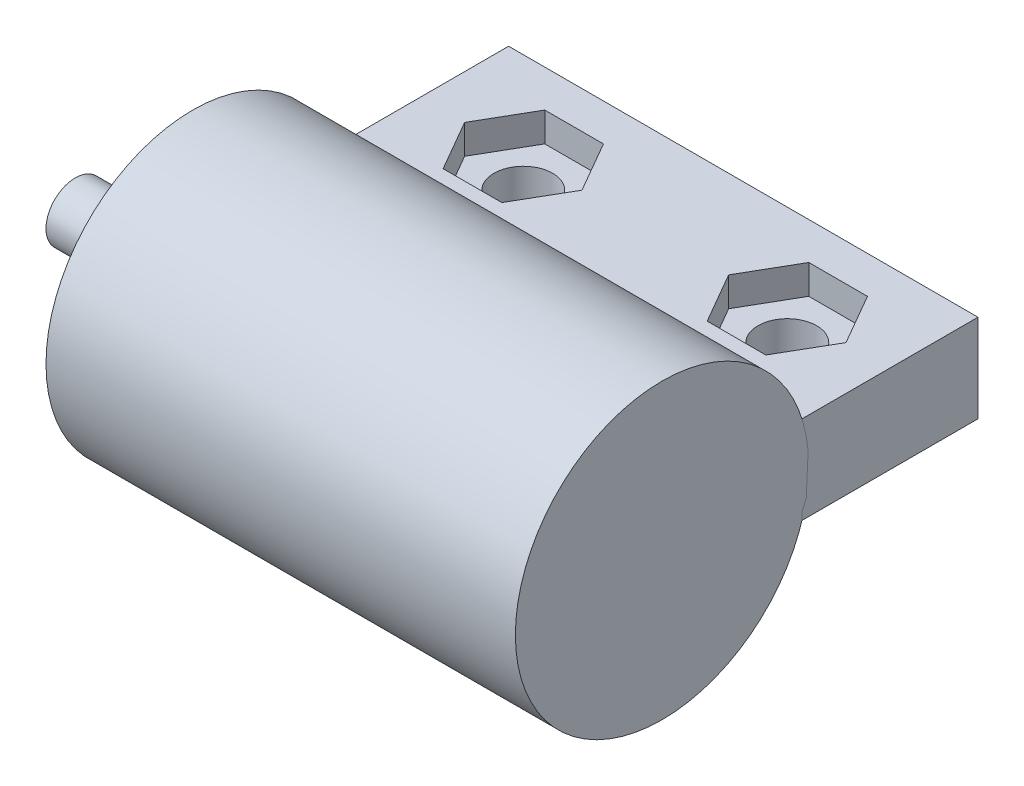
ISO-10303-21;
HEADER;
FILE_DESCRIPTION(('STEP AP214'),'2;1');
FILE_NAME('part.step','',(''),(''),'','','');
FILE_SCHEMA(('AUTOMOTIVE_DESIGN { 1 0 10303 214 1 1 1 1 }'));
ENDSEC;
DATA;
#1=APPLICATION_CONTEXT('core data for automotive mechanical design processes');
#2=APPLICATION_PROTOCOL_DEFINITION('international standard','automotive_design',2000,#1);
#3=PRODUCT_CONTEXT('',#1,'mechanical');
#4=PRODUCT('Part','Part','',(#3));
#5=PRODUCT_RELATED_PRODUCT_CATEGORY('part','',(#4));
#6=PRODUCT_DEFINITION_FORMATION('','',#4);
#7=PRODUCT_DEFINITION_CONTEXT('part definition',#1,'design');
#8=PRODUCT_DEFINITION('design','',#6,#7);
#9=PRODUCT_DEFINITION_SHAPE('','',#8);
#10=(LENGTH_UNIT() NAMED_UNIT(*) SI_UNIT(.MILLI.,.METRE.));
#11=(NAMED_UNIT(*) PLANE_ANGLE_UNIT() SI_UNIT($,.RADIAN.));
#12=(NAMED_UNIT(*) SI_UNIT($,.STERADIAN.) SOLID_ANGLE_UNIT());
#13=UNCERTAINTY_MEASURE_WITH_UNIT(LENGTH_MEASURE(1.E-05),#10,'distance_accuracy_value','');
#14=(GEOMETRIC_REPRESENTATION_CONTEXT(3) GLOBAL_UNCERTAINTY_ASSIGNED_CONTEXT((#13)) GLOBAL_UNIT_ASSIGNED_CONTEXT((#10,
#11,#12)) REPRESENTATION_CONTEXT('',''));
#15=CARTESIAN_POINT('',(0.,0.,0.));
#16=DIRECTION('',(0.,0.,1.));
#17=DIRECTION('',(1.,0.,0.));
#18=AXIS2_PLACEMENT_3D('',#15,#16,#17);
#19=CARTESIAN_POINT('',(-7.07106781186547,0.749999999999999,2.38484800354237));
#20=DIRECTION('',(1.,0.,0.));
#21=DIRECTION('',(0.,0.,-1.));
#22=AXIS2_PLACEMENT_3D('',#19,#20,#21);
#23=CYLINDRICAL_SURFACE('',#22,2.5);
#24=CARTESIAN_POINT('',(0.,0.749999999999999,2.38484800354237));
#25=DIRECTION('',(1.,0.,0.));
#26=DIRECTION('',(0.,0.,-1.));
#27=AXIS2_PLACEMENT_3D('',#24,#25,#26);
#28=CIRCLE('',#27,2.5);
#29=CARTESIAN_POINT('',(0.,0.749999999999999,-0.115151996457631));
#30=VERTEX_POINT('',#29);
#31=EDGE_CURVE('E58',#30,#30,#28,.F.);
#32=ORIENTED_EDGE('',*,*,#31,.F.);
#33=EDGE_LOOP('',(#32));
#34=FACE_BOUND('',#33,.T.);
#35=CARTESIAN_POINT('',(8.,0.749999999999999,2.38484800354237));
#36=DIRECTION('',(1.,0.,0.));
#37=DIRECTION('',(0.,0.,-1.));
#38=AXIS2_PLACEMENT_3D('',#35,#36,#37);
#39=CIRCLE('',#38,2.5);
#40=CARTESIAN_POINT('',(8.,0.749999999999999,-0.115151996457631));
#41=VERTEX_POINT('',#40);
#42=EDGE_CURVE('E68',#41,#41,#39,.T.);
#43=ORIENTED_EDGE('',*,*,#42,.F.);
#44=EDGE_LOOP('',(#43));
#45=FACE_BOUND('',#44,.T.);
#46=ADVANCED_FACE('F55',(#34,#45),#23,.T.);
#47=CARTESIAN_POINT('',(8.,0.749999999999999,2.38484800354237));
#48=DIRECTION('',(1.,0.,0.));
#49=DIRECTION('',(0.,0.,-1.));
#50=AXIS2_PLACEMENT_3D('',#47,#48,#49);
#51=PLANE('',#50);
#52=ORIENTED_EDGE('',*,*,#42,.T.);
#53=EDGE_LOOP('',(#52));
#54=FACE_BOUND('',#53,.T.);
#55=ADVANCED_FACE('F90',(#54),#51,.T.);
#56=CARTESIAN_POINT('',(0.,1.,0.));
#57=DIRECTION('',(1.,0.,0.));
#58=DIRECTION('',(0.,0.,-1.));
#59=AXIS2_PLACEMENT_3D('',#56,#57,#58);
#60=PLANE('',#59);
#61=CARTESIAN_POINT('',(0.,0.749999999999999,2.38484800354236));
#62=DIRECTION('',(-1.,0.,0.));
#63=DIRECTION('',(0.,0.,1.));
#64=AXIS2_PLACEMENT_3D('',#61,#62,#63);
#65=CIRCLE('',#64,0.5);
#66=CARTESIAN_POINT('',(0.,0.749999999999999,2.88484800354236));
#67=VERTEX_POINT('',#66);
#68=EDGE_CURVE('E11',#67,#67,#65,.T.);
#69=ORIENTED_EDGE('',*,*,#68,.F.);
#70=EDGE_LOOP('',(#69));
#71=FACE_BOUND('',#70,.T.);
#72=ORIENTED_EDGE('',*,*,#31,.T.);
#73=EDGE_LOOP('',(#72));
#74=FACE_BOUND('',#73,.T.);
#75=ADVANCED_FACE('F83',(#71,#74),#60,.F.);
#76=CARTESIAN_POINT('',(-2.,0.749999999999999,2.38484800354236));
#77=DIRECTION('',(1.,0.,0.));
#78=DIRECTION('',(0.,0.,-1.));
#79=AXIS2_PLACEMENT_3D('',#76,#77,#78);
#80=CYLINDRICAL_SURFACE('',#79,0.5);
#81=CARTESIAN_POINT('',(-2.,0.749999999999999,2.38484800354236));
#82=DIRECTION('',(-1.,0.,0.));
#83=DIRECTION('',(0.,0.,1.));
#84=AXIS2_PLACEMENT_3D('',#81,#82,#83);
#85=CIRCLE('',#84,0.5);
#86=CARTESIAN_POINT('',(-2.,0.749999999999999,2.88484800354236));
#87=VERTEX_POINT('',#86);
#88=EDGE_CURVE('E70',#87,#87,#85,.T.);
#89=ORIENTED_EDGE('',*,*,#88,.F.);
#90=EDGE_LOOP('',(#89));
#91=FACE_BOUND('',#90,.T.);
#92=ORIENTED_EDGE('',*,*,#68,.T.);
#93=EDGE_LOOP('',(#92));
#94=FACE_BOUND('',#93,.T.);
#95=ADVANCED_FACE('F81',(#91,#94),#80,.T.);
#96=CARTESIAN_POINT('',(-2.,0.749999999999999,2.38484800354236));
#97=DIRECTION('',(-1.,0.,0.));
#98=DIRECTION('',(0.,0.,1.));
#99=AXIS2_PLACEMENT_3D('',#96,#97,#98);
#100=PLANE('',#99);
#101=ORIENTED_EDGE('',*,*,#88,.T.);
#102=EDGE_LOOP('',(#101));
#103=FACE_BOUND('',#102,.T.);
#104=ADVANCED_FACE('F79',(#103),#100,.T.);
#105=CLOSED_SHELL('',(#46,#55,#75,#95,#104));
#106=MANIFOLD_SOLID_BREP('B2',#105);
#107=CARTESIAN_POINT('',(0.,1.,0.));
#108=DIRECTION('',(0.,-1.,0.));
#109=DIRECTION('',(0.,0.,-1.));
#110=AXIS2_PLACEMENT_3D('',#107,#108,#109);
#111=PLANE('',#110);
#112=CARTESIAN_POINT('',(1.75,1.,-1.5));
#113=DIRECTION('',(0.,1.,0.));
#114=DIRECTION('',(0.,0.,1.));
#115=AXIS2_PLACEMENT_3D('',#112,#113,#114);
#116=CIRCLE('',#115,0.5);
#117=CARTESIAN_POINT('',(1.75,1.,-1.));
#118=VERTEX_POINT('',#117);
#119=EDGE_CURVE('E283',#118,#118,#116,.T.);
#120=ORIENTED_EDGE('',*,*,#119,.F.);
#121=EDGE_LOOP('',(#120));
#122=FACE_BOUND('',#121,.T.);
#123=DIRECTION('',(-1.,0.,0.));
#124=VECTOR('',#123,1.);
#125=CARTESIAN_POINT('',(0.,1.,-0.63397459621556));
#126=LINE('',#125,#124);
#127=CARTESIAN_POINT('',(2.25,1.,-0.63397459621556));
#128=VERTEX_POINT('',#127);
#129=CARTESIAN_POINT('',(1.25,1.,-0.63397459621556));
#130=VERTEX_POINT('',#129);
#131=EDGE_CURVE('E145',#128,#130,#126,.T.);
#132=ORIENTED_EDGE('',*,*,#131,.F.);
#133=DIRECTION('',(0.499999999999998,0.,-0.86602540378444));
#134=VECTOR('',#133,1.);
#135=CARTESIAN_POINT('',(1.41298094716168,1.,0.815784930203602));
#136=LINE('',#135,#134);
#137=CARTESIAN_POINT('',(2.75,1.,-1.5));
#138=VERTEX_POINT('',#137);
#139=EDGE_CURVE('E150',#128,#138,#136,.T.);
#140=ORIENTED_EDGE('',*,*,#139,.T.);
#141=DIRECTION('',(0.499999999999998,0.,0.86602540378444));
#142=VECTOR('',#141,1.);
#143=CARTESIAN_POINT('',(2.71201905283833,1.,-1.5657849302036));
#144=LINE('',#143,#142);
#145=CARTESIAN_POINT('',(2.25,1.,-2.36602540378444));
#146=VERTEX_POINT('',#145);
#147=EDGE_CURVE('E360',#146,#138,#144,.T.);
#148=ORIENTED_EDGE('',*,*,#147,.F.);
#149=DIRECTION('',(-1.,0.,0.));
#150=VECTOR('',#149,1.);
#151=CARTESIAN_POINT('',(0.,1.,-2.36602540378444));
#152=LINE('',#151,#150);
#153=CARTESIAN_POINT('',(1.25,1.,-2.36602540378444));
#154=VERTEX_POINT('',#153);
#155=EDGE_CURVE('E358',#146,#154,#152,.T.);
#156=ORIENTED_EDGE('',*,*,#155,.T.);
#157=DIRECTION('',(-0.499999999999998,0.,0.86602540378444));
#158=VECTOR('',#157,1.);
#159=CARTESIAN_POINT('',(-0.0870190528383232,1.,-0.0502404735808319));
#160=LINE('',#159,#158);
#161=CARTESIAN_POINT('',(0.750000000000002,1.,-1.5));
#162=VERTEX_POINT('',#161);
#163=EDGE_CURVE('E356',#154,#162,#160,.T.);
#164=ORIENTED_EDGE('',*,*,#163,.T.);
#165=DIRECTION('',(-0.499999999999998,0.,-0.86602540378444));
#166=VECTOR('',#165,1.);
#167=CARTESIAN_POINT('',(1.21201905283833,1.,-0.699759526419161));
#168=LINE('',#167,#166);
#169=EDGE_CURVE('E354',#130,#162,#168,.T.);
#170=ORIENTED_EDGE('',*,*,#169,.F.);
#171=EDGE_LOOP('',(#132,#140,#148,#156,#164,#170));
#172=FACE_BOUND('',#171,.T.);
#173=ADVANCED_FACE('F130',(#122,#172),#111,.F.);
#174=DIRECTION('',(1.,0.,0.));
#175=VECTOR('',#174,1.);
#176=CARTESIAN_POINT('',(0.,1.,-2.36602540378444));
#177=LINE('',#176,#175);
#178=CARTESIAN_POINT('',(5.75,1.,-2.36602540378444));
#179=VERTEX_POINT('',#178);
#180=CARTESIAN_POINT('',(6.75,1.,-2.36602540378444));
#181=VERTEX_POINT('',#180);
#182=EDGE_CURVE('E366',#179,#181,#177,.T.);
#183=ORIENTED_EDGE('',*,*,#182,.F.);
#184=DIRECTION('',(-0.499999999999997,0.,0.86602540378444));
#185=VECTOR('',#184,1.);
#186=CARTESIAN_POINT('',(3.28798094716169,1.,1.89831668493415));
#187=LINE('',#186,#185);
#188=CARTESIAN_POINT('',(5.25,1.,-1.5));
#189=VERTEX_POINT('',#188);
#190=EDGE_CURVE('E364',#179,#189,#187,.T.);
#191=ORIENTED_EDGE('',*,*,#190,.T.);
#192=DIRECTION('',(-0.499999999999997,0.,-0.86602540378444));
#193=VECTOR('',#192,1.);
#194=CARTESIAN_POINT('',(4.58701905283834,1.,-2.64831668493414));
#195=LINE('',#194,#193);
#196=CARTESIAN_POINT('',(5.75,1.,-0.633974596215561));
#197=VERTEX_POINT('',#196);
#198=EDGE_CURVE('E263',#197,#189,#195,.T.);
#199=ORIENTED_EDGE('',*,*,#198,.F.);
#200=DIRECTION('',(1.,0.,0.));
#201=VECTOR('',#200,1.);
#202=CARTESIAN_POINT('',(0.,1.,-0.63397459621556));
#203=LINE('',#202,#201);
#204=CARTESIAN_POINT('',(6.75,1.,-0.633974596215561));
#205=VERTEX_POINT('',#204);
#206=EDGE_CURVE('E374',#197,#205,#203,.T.);
#207=ORIENTED_EDGE('',*,*,#206,.T.);
#208=DIRECTION('',(0.499999999999997,0.,-0.86602540378444));
#209=VECTOR('',#208,1.);
#210=CARTESIAN_POINT('',(4.78798094716169,1.,2.76434208871858));
#211=LINE('',#210,#209);
#212=CARTESIAN_POINT('',(7.25,1.,-1.5));
#213=VERTEX_POINT('',#212);
#214=EDGE_CURVE('E372',#205,#213,#211,.T.);
#215=ORIENTED_EDGE('',*,*,#214,.T.);
#216=DIRECTION('',(0.499999999999998,0.,0.86602540378444));
#217=VECTOR('',#216,1.);
#218=CARTESIAN_POINT('',(6.08701905283834,1.,-3.51434208871858));
#219=LINE('',#218,#217);
#220=EDGE_CURVE('E369',#181,#213,#219,.T.);
#221=ORIENTED_EDGE('',*,*,#220,.F.);
#222=EDGE_LOOP('',(#183,#191,#199,#207,#215,#221));
#223=FACE_BOUND('',#222,.T.);
#224=CARTESIAN_POINT('',(6.25,1.,-1.5));
#225=DIRECTION('',(0.,1.,0.));
#226=DIRECTION('',(0.,0.,1.));
#227=AXIS2_PLACEMENT_3D('',#224,#225,#226);
#228=CIRCLE('',#227,0.500000000000001);
#229=CARTESIAN_POINT('',(6.25,1.,-0.999999999999999));
#230=VERTEX_POINT('',#229);
#231=EDGE_CURVE('E275',#230,#230,#228,.T.);
#232=ORIENTED_EDGE('',*,*,#231,.F.);
#233=EDGE_LOOP('',(#232));
#234=FACE_BOUND('',#233,.T.);
#235=ADVANCED_FACE('F426',(#223,#234),#111,.F.);
#236=CARTESIAN_POINT('',(0.,0.,0.));
#237=DIRECTION('',(0.,-1.,0.));
#238=DIRECTION('',(0.,0.,-1.));
#239=AXIS2_PLACEMENT_3D('',#236,#237,#238);
#240=PLANE('',#239);
#241=CARTESIAN_POINT('',(1.75,0.,-1.5));
#242=DIRECTION('',(0.,1.,0.));
#243=DIRECTION('',(0.,0.,1.));
#244=AXIS2_PLACEMENT_3D('',#241,#242,#243);
#245=CIRCLE('',#244,0.5);
#246=CARTESIAN_POINT('',(1.75,0.,-1.));
#247=VERTEX_POINT('',#246);
#248=EDGE_CURVE('E278',#247,#247,#245,.T.);
#249=ORIENTED_EDGE('',*,*,#248,.T.);
#250=EDGE_LOOP('',(#249));
#251=FACE_BOUND('',#250,.T.);
#252=DIRECTION('',(0.,0.,1.));
#253=VECTOR('',#252,1.);
#254=CARTESIAN_POINT('',(0.,0.,0.));
#255=LINE('',#254,#253);
#256=CARTESIAN_POINT('',(0.,0.,-3.));
#257=VERTEX_POINT('',#256);
#258=CARTESIAN_POINT('',(0.,0.,0.));
#259=VERTEX_POINT('',#258);
#260=EDGE_CURVE('E286',#257,#259,#255,.T.);
#261=ORIENTED_EDGE('',*,*,#260,.F.);
#262=DIRECTION('',(-1.,0.,0.));
#263=VECTOR('',#262,1.);
#264=CARTESIAN_POINT('',(0.,0.,-3.));
#265=LINE('',#264,#263);
#266=CARTESIAN_POINT('',(8.,0.,-3.));
#267=VERTEX_POINT('',#266);
#268=EDGE_CURVE('E295',#267,#257,#265,.T.);
#269=ORIENTED_EDGE('',*,*,#268,.F.);
#270=DIRECTION('',(0.,0.,-1.));
#271=VECTOR('',#270,1.);
#272=CARTESIAN_POINT('',(8.,0.,0.));
#273=LINE('',#272,#271);
#274=CARTESIAN_POINT('',(8.,0.,0.));
#275=VERTEX_POINT('',#274);
#276=EDGE_CURVE('E293',#275,#267,#273,.T.);
#277=ORIENTED_EDGE('',*,*,#276,.F.);
#278=DIRECTION('',(1.,0.,0.));
#279=VECTOR('',#278,1.);
#280=CARTESIAN_POINT('',(0.,0.,0.));
#281=LINE('',#280,#279);
#282=EDGE_CURVE('E291',#259,#275,#281,.T.);
#283=ORIENTED_EDGE('',*,*,#282,.F.);
#284=EDGE_LOOP('',(#261,#269,#277,#283));
#285=FACE_BOUND('',#284,.T.);
#286=CARTESIAN_POINT('',(6.25,0.,-1.5));
#287=DIRECTION('',(0.,1.,0.));
#288=DIRECTION('',(0.,0.,1.));
#289=AXIS2_PLACEMENT_3D('',#286,#287,#288);
#290=CIRCLE('',#289,0.500000000000001);
#291=CARTESIAN_POINT('',(6.25,0.,-0.999999999999999));
#292=VERTEX_POINT('',#291);
#293=EDGE_CURVE('E279',#292,#292,#290,.T.);
#294=ORIENTED_EDGE('',*,*,#293,.T.);
#295=EDGE_LOOP('',(#294));
#296=FACE_BOUND('',#295,.T.);
#297=ADVANCED_FACE('F315',(#251,#285,#296),#240,.T.);
#298=CARTESIAN_POINT('',(0.,1.,0.));
#299=DIRECTION('',(1.,0.,0.));
#300=DIRECTION('',(0.,0.,-1.));
#301=AXIS2_PLACEMENT_3D('',#298,#299,#300);
#302=PLANE('',#301);
#303=ORIENTED_EDGE('',*,*,#260,.T.);
#304=DIRECTION('',(0.,-1.,0.));
#305=VECTOR('',#304,1.);
#306=CARTESIAN_POINT('',(0.,1.,0.));
#307=LINE('',#306,#305);
#308=CARTESIAN_POINT('',(0.,1.5,0.));
#309=VERTEX_POINT('',#308);
#310=EDGE_CURVE('E53',#309,#259,#307,.T.);
#311=ORIENTED_EDGE('',*,*,#310,.F.);
#312=DIRECTION('',(0.,0.,1.));
#313=VECTOR('',#312,1.);
#314=CARTESIAN_POINT('',(0.,1.5,0.));
#315=LINE('',#314,#313);
#316=CARTESIAN_POINT('',(0.,1.5,-3.));
#317=VERTEX_POINT('',#316);
#318=EDGE_CURVE('E323',#317,#309,#315,.T.);
#319=ORIENTED_EDGE('',*,*,#318,.F.);
#320=DIRECTION('',(0.,-1.,0.));
#321=VECTOR('',#320,1.);
#322=CARTESIAN_POINT('',(0.,1.,-3.));
#323=LINE('',#322,#321);
#324=EDGE_CURVE('E297',#317,#257,#323,.T.);
#325=ORIENTED_EDGE('',*,*,#324,.T.);
#326=EDGE_LOOP('',(#303,#311,#319,#325));
#327=FACE_BOUND('',#326,.T.);
#328=ADVANCED_FACE('F132',(#327),#302,.F.);
#329=CARTESIAN_POINT('',(0.,1.,0.));
#330=DIRECTION('',(0.,0.,-1.));
#331=DIRECTION('',(-1.,0.,0.));
#332=AXIS2_PLACEMENT_3D('',#329,#330,#331);
#333=PLANE('',#332);
#334=ORIENTED_EDGE('',*,*,#282,.T.);
#335=DIRECTION('',(0.,-1.,0.));
#336=VECTOR('',#335,1.);
#337=CARTESIAN_POINT('',(8.,1.,0.));
#338=LINE('',#337,#336);
#339=CARTESIAN_POINT('',(8.,1.5,0.));
#340=VERTEX_POINT('',#339);
#341=EDGE_CURVE('E138',#340,#275,#338,.T.);
#342=ORIENTED_EDGE('',*,*,#341,.F.);
#343=DIRECTION('',(1.,0.,0.));
#344=VECTOR('',#343,1.);
#345=CARTESIAN_POINT('',(0.,1.5,0.));
#346=LINE('',#345,#344);
#347=EDGE_CURVE('E325',#309,#340,#346,.T.);
#348=ORIENTED_EDGE('',*,*,#347,.F.);
#349=ORIENTED_EDGE('',*,*,#310,.T.);
#350=EDGE_LOOP('',(#334,#342,#348,#349));
#351=FACE_BOUND('',#350,.T.);
#352=ADVANCED_FACE('F445',(#351),#333,.F.);
#353=CARTESIAN_POINT('',(8.,1.,0.));
#354=DIRECTION('',(-1.,0.,0.));
#355=DIRECTION('',(0.,0.,1.));
#356=AXIS2_PLACEMENT_3D('',#353,#354,#355);
#357=PLANE('',#356);
#358=ORIENTED_EDGE('',*,*,#276,.T.);
#359=DIRECTION('',(0.,-1.,0.));
#360=VECTOR('',#359,1.);
#361=CARTESIAN_POINT('',(8.,1.,-3.));
#362=LINE('',#361,#360);
#363=CARTESIAN_POINT('',(8.,1.5,-3.));
#364=VERTEX_POINT('',#363);
#365=EDGE_CURVE('E300',#364,#267,#362,.T.);
#366=ORIENTED_EDGE('',*,*,#365,.F.);
#367=DIRECTION('',(0.,0.,-1.));
#368=VECTOR('',#367,1.);
#369=CARTESIAN_POINT('',(8.,1.5,0.));
#370=LINE('',#369,#368);
#371=EDGE_CURVE('E308',#340,#364,#370,.T.);
#372=ORIENTED_EDGE('',*,*,#371,.F.);
#373=ORIENTED_EDGE('',*,*,#341,.T.);
#374=EDGE_LOOP('',(#358,#366,#372,#373));
#375=FACE_BOUND('',#374,.T.);
#376=ADVANCED_FACE('F306',(#375),#357,.F.);
#377=CARTESIAN_POINT('',(0.,1.,-3.));
#378=DIRECTION('',(0.,0.,1.));
#379=DIRECTION('',(1.,0.,0.));
#380=AXIS2_PLACEMENT_3D('',#377,#378,#379);
#381=PLANE('',#380);
#382=ORIENTED_EDGE('',*,*,#268,.T.);
#383=ORIENTED_EDGE('',*,*,#324,.F.);
#384=DIRECTION('',(-1.,0.,0.));
#385=VECTOR('',#384,1.);
#386=CARTESIAN_POINT('',(0.,1.5,-3.));
#387=LINE('',#386,#385);
#388=EDGE_CURVE('E326',#364,#317,#387,.T.);
#389=ORIENTED_EDGE('',*,*,#388,.F.);
#390=ORIENTED_EDGE('',*,*,#365,.T.);
#391=EDGE_LOOP('',(#382,#383,#389,#390));
#392=FACE_BOUND('',#391,.T.);
#393=ADVANCED_FACE('F318',(#392),#381,.F.);
#394=CARTESIAN_POINT('',(1.75,1.,-1.5));
#395=DIRECTION('',(0.,-1.,0.));
#396=DIRECTION('',(0.,0.,-1.));
#397=AXIS2_PLACEMENT_3D('',#394,#395,#396);
#398=CYLINDRICAL_SURFACE('',#397,0.5);
#399=ORIENTED_EDGE('',*,*,#119,.T.);
#400=EDGE_LOOP('',(#399));
#401=FACE_BOUND('',#400,.T.);
#402=ORIENTED_EDGE('',*,*,#248,.F.);
#403=EDGE_LOOP('',(#402));
#404=FACE_BOUND('',#403,.T.);
#405=ADVANCED_FACE('F437',(#401,#404),#398,.F.);
#406=CARTESIAN_POINT('',(6.25,1.,-1.5));
#407=DIRECTION('',(0.,-1.,0.));
#408=DIRECTION('',(0.,0.,-1.));
#409=AXIS2_PLACEMENT_3D('',#406,#407,#408);
#410=CYLINDRICAL_SURFACE('',#409,0.500000000000001);
#411=ORIENTED_EDGE('',*,*,#231,.T.);
#412=EDGE_LOOP('',(#411));
#413=FACE_BOUND('',#412,.T.);
#414=ORIENTED_EDGE('',*,*,#293,.F.);
#415=EDGE_LOOP('',(#414));
#416=FACE_BOUND('',#415,.T.);
#417=ADVANCED_FACE('F501',(#413,#416),#410,.F.);
#418=CARTESIAN_POINT('',(3.28798094716169,1.5,1.89831668493415));
#419=DIRECTION('',(0.86602540378444,0.,0.499999999999997));
#420=DIRECTION('',(0.499999999999997,0.,-0.86602540378444));
#421=AXIS2_PLACEMENT_3D('',#418,#419,#420);
#422=PLANE('',#421);
#423=ORIENTED_EDGE('',*,*,#190,.F.);
#424=DIRECTION('',(0.,-1.,0.));
#425=VECTOR('',#424,1.);
#426=CARTESIAN_POINT('',(5.75,1.5,-2.36602540378444));
#427=LINE('',#426,#425);
#428=CARTESIAN_POINT('',(5.75,1.5,-2.36602540378444));
#429=VERTEX_POINT('',#428);
#430=EDGE_CURVE('E282',#429,#179,#427,.T.);
#431=ORIENTED_EDGE('',*,*,#430,.F.);
#432=DIRECTION('',(-0.499999999999997,0.,0.86602540378444));
#433=VECTOR('',#432,1.);
#434=CARTESIAN_POINT('',(3.28798094716169,1.5,1.89831668493415));
#435=LINE('',#434,#433);
#436=CARTESIAN_POINT('',(5.25,1.5,-1.5));
#437=VERTEX_POINT('',#436);
#438=EDGE_CURVE('E336',#429,#437,#435,.T.);
#439=ORIENTED_EDGE('',*,*,#438,.T.);
#440=DIRECTION('',(0.,-1.,0.));
#441=VECTOR('',#440,1.);
#442=CARTESIAN_POINT('',(5.25,1.5,-1.5));
#443=LINE('',#442,#441);
#444=EDGE_CURVE('E266',#437,#189,#443,.T.);
#445=ORIENTED_EDGE('',*,*,#444,.T.);
#446=EDGE_LOOP('',(#423,#431,#439,#445));
#447=FACE_BOUND('',#446,.T.);
#448=ADVANCED_FACE('F508',(#447),#422,.T.);
#449=CARTESIAN_POINT('',(0.,1.5,-2.36602540378444));
#450=DIRECTION('',(0.,0.,-1.));
#451=DIRECTION('',(-1.,0.,0.));
#452=AXIS2_PLACEMENT_3D('',#449,#450,#451);
#453=PLANE('',#452);
#454=ORIENTED_EDGE('',*,*,#182,.T.);
#455=DIRECTION('',(0.,-1.,0.));
#456=VECTOR('',#455,1.);
#457=CARTESIAN_POINT('',(6.75,1.5,-2.36602540378444));
#458=LINE('',#457,#456);
#459=CARTESIAN_POINT('',(6.75,1.5,-2.36602540378444));
#460=VERTEX_POINT('',#459);
#461=EDGE_CURVE('E386',#460,#181,#458,.T.);
#462=ORIENTED_EDGE('',*,*,#461,.F.);
#463=DIRECTION('',(1.,0.,0.));
#464=VECTOR('',#463,1.);
#465=CARTESIAN_POINT('',(0.,1.5,-2.36602540378444));
#466=LINE('',#465,#464);
#467=EDGE_CURVE('E339',#429,#460,#466,.T.);
#468=ORIENTED_EDGE('',*,*,#467,.F.);
#469=ORIENTED_EDGE('',*,*,#430,.T.);
#470=EDGE_LOOP('',(#454,#462,#468,#469));
#471=FACE_BOUND('',#470,.T.);
#472=ADVANCED_FACE('F521',(#471),#453,.F.);
#473=CARTESIAN_POINT('',(6.08701905283834,1.5,-3.51434208871858));
#474=DIRECTION('',(0.86602540378444,0.,-0.499999999999998));
#475=DIRECTION('',(-0.499999999999998,0.,-0.86602540378444));
#476=AXIS2_PLACEMENT_3D('',#473,#474,#475);
#477=PLANE('',#476);
#478=ORIENTED_EDGE('',*,*,#220,.T.);
#479=DIRECTION('',(0.,-1.,0.));
#480=VECTOR('',#479,1.);
#481=CARTESIAN_POINT('',(7.25,1.5,-1.5));
#482=LINE('',#481,#480);
#483=CARTESIAN_POINT('',(7.25,1.5,-1.5));
#484=VERTEX_POINT('',#483);
#485=EDGE_CURVE('E383',#484,#213,#482,.T.);
#486=ORIENTED_EDGE('',*,*,#485,.F.);
#487=DIRECTION('',(0.499999999999998,0.,0.86602540378444));
#488=VECTOR('',#487,1.);
#489=CARTESIAN_POINT('',(6.08701905283834,1.5,-3.51434208871858));
#490=LINE('',#489,#488);
#491=EDGE_CURVE('E342',#460,#484,#490,.T.);
#492=ORIENTED_EDGE('',*,*,#491,.F.);
#493=ORIENTED_EDGE('',*,*,#461,.T.);
#494=EDGE_LOOP('',(#478,#486,#492,#493));
#495=FACE_BOUND('',#494,.T.);
#496=ADVANCED_FACE('F529',(#495),#477,.F.);
#497=CARTESIAN_POINT('',(4.78798094716169,1.5,2.76434208871858));
#498=DIRECTION('',(-0.86602540378444,0.,-0.499999999999997));
#499=DIRECTION('',(-0.499999999999997,0.,0.86602540378444));
#500=AXIS2_PLACEMENT_3D('',#497,#498,#499);
#501=PLANE('',#500);
#502=ORIENTED_EDGE('',*,*,#214,.F.);
#503=DIRECTION('',(0.,-1.,0.));
#504=VECTOR('',#503,1.);
#505=CARTESIAN_POINT('',(6.75,1.5,-0.633974596215561));
#506=LINE('',#505,#504);
#507=CARTESIAN_POINT('',(6.75,1.5,-0.633974596215561));
#508=VERTEX_POINT('',#507);
#509=EDGE_CURVE('E380',#508,#205,#506,.T.);
#510=ORIENTED_EDGE('',*,*,#509,.F.);
#511=DIRECTION('',(0.499999999999997,0.,-0.86602540378444));
#512=VECTOR('',#511,1.);
#513=CARTESIAN_POINT('',(4.78798094716169,1.5,2.76434208871858));
#514=LINE('',#513,#512);
#515=EDGE_CURVE('E344',#508,#484,#514,.T.);
#516=ORIENTED_EDGE('',*,*,#515,.T.);
#517=ORIENTED_EDGE('',*,*,#485,.T.);
#518=EDGE_LOOP('',(#502,#510,#516,#517));
#519=FACE_BOUND('',#518,.T.);
#520=ADVANCED_FACE('F538',(#519),#501,.T.);
#521=CARTESIAN_POINT('',(0.,1.5,-0.63397459621556));
#522=DIRECTION('',(0.,0.,-1.));
#523=DIRECTION('',(-1.,0.,0.));
#524=AXIS2_PLACEMENT_3D('',#521,#522,#523);
#525=PLANE('',#524);
#526=ORIENTED_EDGE('',*,*,#206,.F.);
#527=DIRECTION('',(0.,-1.,0.));
#528=VECTOR('',#527,1.);
#529=CARTESIAN_POINT('',(5.75,1.5,-0.633974596215561));
#530=LINE('',#529,#528);
#531=CARTESIAN_POINT('',(5.75,1.5,-0.633974596215561));
#532=VERTEX_POINT('',#531);
#533=EDGE_CURVE('E269',#532,#197,#530,.T.);
#534=ORIENTED_EDGE('',*,*,#533,.F.);
#535=DIRECTION('',(1.,0.,0.));
#536=VECTOR('',#535,1.);
#537=CARTESIAN_POINT('',(0.,1.5,-0.63397459621556));
#538=LINE('',#537,#536);
#539=EDGE_CURVE('E347',#532,#508,#538,.T.);
#540=ORIENTED_EDGE('',*,*,#539,.T.);
#541=ORIENTED_EDGE('',*,*,#509,.T.);
#542=EDGE_LOOP('',(#526,#534,#540,#541));
#543=FACE_BOUND('',#542,.T.);
#544=ADVANCED_FACE('F547',(#543),#525,.T.);
#545=CARTESIAN_POINT('',(0.,1.5,-0.63397459621556));
#546=DIRECTION('',(0.,0.,1.));
#547=DIRECTION('',(1.,0.,0.));
#548=AXIS2_PLACEMENT_3D('',#545,#546,#547);
#549=PLANE('',#548);
#550=ORIENTED_EDGE('',*,*,#131,.T.);
#551=DIRECTION('',(0.,-1.,0.));
#552=VECTOR('',#551,1.);
#553=CARTESIAN_POINT('',(1.25,1.5,-0.63397459621556));
#554=LINE('',#553,#552);
#555=CARTESIAN_POINT('',(1.25,1.5,-0.63397459621556));
#556=VERTEX_POINT('',#555);
#557=EDGE_CURVE('E247',#556,#130,#554,.T.);
#558=ORIENTED_EDGE('',*,*,#557,.F.);
#559=DIRECTION('',(-1.,0.,0.));
#560=VECTOR('',#559,1.);
#561=CARTESIAN_POINT('',(0.,1.5,-0.63397459621556));
#562=LINE('',#561,#560);
#563=CARTESIAN_POINT('',(2.25,1.5,-0.63397459621556));
#564=VERTEX_POINT('',#563);
#565=EDGE_CURVE('E254',#564,#556,#562,.T.);
#566=ORIENTED_EDGE('',*,*,#565,.F.);
#567=DIRECTION('',(0.,-1.,0.));
#568=VECTOR('',#567,1.);
#569=CARTESIAN_POINT('',(2.25,1.5,-0.63397459621556));
#570=LINE('',#569,#568);
#571=EDGE_CURVE('E352',#564,#128,#570,.T.);
#572=ORIENTED_EDGE('',*,*,#571,.T.);
#573=EDGE_LOOP('',(#550,#558,#566,#572));
#574=FACE_BOUND('',#573,.T.);
#575=ADVANCED_FACE('F265',(#574),#549,.F.);
#576=CARTESIAN_POINT('',(1.21201905283833,1.5,-0.699759526419161));
#577=DIRECTION('',(-0.86602540378444,0.,0.499999999999998));
#578=DIRECTION('',(0.499999999999998,0.,0.86602540378444));
#579=AXIS2_PLACEMENT_3D('',#576,#577,#578);
#580=PLANE('',#579);
#581=ORIENTED_EDGE('',*,*,#169,.T.);
#582=DIRECTION('',(0.,-1.,0.));
#583=VECTOR('',#582,1.);
#584=CARTESIAN_POINT('',(0.750000000000002,1.5,-1.5));
#585=LINE('',#584,#583);
#586=CARTESIAN_POINT('',(0.750000000000002,1.5,-1.5));
#587=VERTEX_POINT('',#586);
#588=EDGE_CURVE('E249',#587,#162,#585,.T.);
#589=ORIENTED_EDGE('',*,*,#588,.F.);
#590=DIRECTION('',(-0.499999999999998,0.,-0.86602540378444));
#591=VECTOR('',#590,1.);
#592=CARTESIAN_POINT('',(1.21201905283833,1.5,-0.699759526419161));
#593=LINE('',#592,#591);
#594=EDGE_CURVE('E242',#556,#587,#593,.T.);
#595=ORIENTED_EDGE('',*,*,#594,.F.);
#596=ORIENTED_EDGE('',*,*,#557,.T.);
#597=EDGE_LOOP('',(#581,#589,#595,#596));
#598=FACE_BOUND('',#597,.T.);
#599=ADVANCED_FACE('F245',(#598),#580,.F.);
#600=CARTESIAN_POINT('',(-0.0870190528383232,1.5,-0.0502404735808319));
#601=DIRECTION('',(0.86602540378444,0.,0.499999999999998));
#602=DIRECTION('',(0.499999999999998,0.,-0.86602540378444));
#603=AXIS2_PLACEMENT_3D('',#600,#601,#602);
#604=PLANE('',#603);
#605=ORIENTED_EDGE('',*,*,#163,.F.);
#606=DIRECTION('',(0.,-1.,0.));
#607=VECTOR('',#606,1.);
#608=CARTESIAN_POINT('',(1.25,1.5,-2.36602540378444));
#609=LINE('',#608,#607);
#610=CARTESIAN_POINT('',(1.25,1.5,-2.36602540378444));
#611=VERTEX_POINT('',#610);
#612=EDGE_CURVE('E271',#611,#154,#609,.T.);
#613=ORIENTED_EDGE('',*,*,#612,.F.);
#614=DIRECTION('',(-0.499999999999998,0.,0.86602540378444));
#615=VECTOR('',#614,1.);
#616=CARTESIAN_POINT('',(-0.0870190528383232,1.5,-0.0502404735808319));
#617=LINE('',#616,#615);
#618=EDGE_CURVE('E253',#611,#587,#617,.T.);
#619=ORIENTED_EDGE('',*,*,#618,.T.);
#620=ORIENTED_EDGE('',*,*,#588,.T.);
#621=EDGE_LOOP('',(#605,#613,#619,#620));
#622=FACE_BOUND('',#621,.T.);
#623=ADVANCED_FACE('F405',(#622),#604,.T.);
#624=CARTESIAN_POINT('',(0.,1.5,-2.36602540378444));
#625=DIRECTION('',(0.,0.,1.));
#626=DIRECTION('',(1.,0.,0.));
#627=AXIS2_PLACEMENT_3D('',#624,#625,#626);
#628=PLANE('',#627);
#629=ORIENTED_EDGE('',*,*,#155,.F.);
#630=DIRECTION('',(0.,-1.,0.));
#631=VECTOR('',#630,1.);
#632=CARTESIAN_POINT('',(2.25,1.5,-2.36602540378444));
#633=LINE('',#632,#631);
#634=CARTESIAN_POINT('',(2.25,1.5,-2.36602540378444));
#635=VERTEX_POINT('',#634);
#636=EDGE_CURVE('E394',#635,#146,#633,.T.);
#637=ORIENTED_EDGE('',*,*,#636,.F.);
#638=DIRECTION('',(-1.,0.,0.));
#639=VECTOR('',#638,1.);
#640=CARTESIAN_POINT('',(0.,1.5,-2.36602540378444));
#641=LINE('',#640,#639);
#642=EDGE_CURVE('E403',#635,#611,#641,.T.);
#643=ORIENTED_EDGE('',*,*,#642,.T.);
#644=ORIENTED_EDGE('',*,*,#612,.T.);
#645=EDGE_LOOP('',(#629,#637,#643,#644));
#646=FACE_BOUND('',#645,.T.);
#647=ADVANCED_FACE('F401',(#646),#628,.T.);
#648=CARTESIAN_POINT('',(2.71201905283833,1.5,-1.5657849302036));
#649=DIRECTION('',(0.86602540378444,0.,-0.499999999999998));
#650=DIRECTION('',(-0.499999999999998,0.,-0.86602540378444));
#651=AXIS2_PLACEMENT_3D('',#648,#649,#650);
#652=PLANE('',#651);
#653=ORIENTED_EDGE('',*,*,#147,.T.);
#654=DIRECTION('',(0.,-1.,0.));
#655=VECTOR('',#654,1.);
#656=CARTESIAN_POINT('',(2.75,1.5,-1.5));
#657=LINE('',#656,#655);
#658=CARTESIAN_POINT('',(2.75,1.5,-1.5));
#659=VERTEX_POINT('',#658);
#660=EDGE_CURVE('E392',#659,#138,#657,.T.);
#661=ORIENTED_EDGE('',*,*,#660,.F.);
#662=DIRECTION('',(0.499999999999998,0.,0.86602540378444));
#663=VECTOR('',#662,1.);
#664=CARTESIAN_POINT('',(2.71201905283833,1.5,-1.5657849302036));
#665=LINE('',#664,#663);
#666=EDGE_CURVE('E330',#635,#659,#665,.T.);
#667=ORIENTED_EDGE('',*,*,#666,.F.);
#668=ORIENTED_EDGE('',*,*,#636,.T.);
#669=EDGE_LOOP('',(#653,#661,#667,#668));
#670=FACE_BOUND('',#669,.T.);
#671=ADVANCED_FACE('F409',(#670),#652,.F.);
#672=CARTESIAN_POINT('',(1.41298094716168,1.5,0.815784930203602));
#673=DIRECTION('',(-0.86602540378444,0.,-0.499999999999998));
#674=DIRECTION('',(-0.499999999999998,0.,0.86602540378444));
#675=AXIS2_PLACEMENT_3D('',#672,#673,#674);
#676=PLANE('',#675);
#677=ORIENTED_EDGE('',*,*,#139,.F.);
#678=ORIENTED_EDGE('',*,*,#571,.F.);
#679=DIRECTION('',(0.499999999999998,0.,-0.86602540378444));
#680=VECTOR('',#679,1.);
#681=CARTESIAN_POINT('',(1.41298094716168,1.5,0.815784930203602));
#682=LINE('',#681,#680);
#683=EDGE_CURVE('E261',#564,#659,#682,.T.);
#684=ORIENTED_EDGE('',*,*,#683,.T.);
#685=ORIENTED_EDGE('',*,*,#660,.T.);
#686=EDGE_LOOP('',(#677,#678,#684,#685));
#687=FACE_BOUND('',#686,.T.);
#688=ADVANCED_FACE('F413',(#687),#676,.T.);
#689=CARTESIAN_POINT('',(4.58701905283834,1.5,-2.64831668493414));
#690=DIRECTION('',(-0.86602540378444,0.,0.499999999999997));
#691=DIRECTION('',(0.499999999999997,0.,0.86602540378444));
#692=AXIS2_PLACEMENT_3D('',#689,#690,#691);
#693=PLANE('',#692);
#694=ORIENTED_EDGE('',*,*,#198,.T.);
#695=ORIENTED_EDGE('',*,*,#444,.F.);
#696=DIRECTION('',(-0.499999999999997,0.,-0.86602540378444));
#697=VECTOR('',#696,1.);
#698=CARTESIAN_POINT('',(4.58701905283834,1.5,-2.64831668493414));
#699=LINE('',#698,#697);
#700=EDGE_CURVE('E350',#532,#437,#699,.T.);
#701=ORIENTED_EDGE('',*,*,#700,.F.);
#702=ORIENTED_EDGE('',*,*,#533,.T.);
#703=EDGE_LOOP('',(#694,#695,#701,#702));
#704=FACE_BOUND('',#703,.T.);
#705=ADVANCED_FACE('F415',(#704),#693,.F.);
#706=CARTESIAN_POINT('',(0.,1.5,0.));
#707=DIRECTION('',(0.,1.,0.));
#708=DIRECTION('',(0.,0.,1.));
#709=AXIS2_PLACEMENT_3D('',#706,#707,#708);
#710=PLANE('',#709);
#711=ORIENTED_EDGE('',*,*,#565,.T.);
#712=ORIENTED_EDGE('',*,*,#594,.T.);
#713=ORIENTED_EDGE('',*,*,#618,.F.);
#714=ORIENTED_EDGE('',*,*,#642,.F.);
#715=ORIENTED_EDGE('',*,*,#666,.T.);
#716=ORIENTED_EDGE('',*,*,#683,.F.);
#717=EDGE_LOOP('',(#711,#712,#713,#714,#715,#716));
#718=FACE_BOUND('',#717,.T.);
#719=ORIENTED_EDGE('',*,*,#388,.T.);
#720=ORIENTED_EDGE('',*,*,#318,.T.);
#721=ORIENTED_EDGE('',*,*,#347,.T.);
#722=ORIENTED_EDGE('',*,*,#371,.T.);
#723=EDGE_LOOP('',(#719,#720,#721,#722));
#724=FACE_BOUND('',#723,.T.);
#725=ORIENTED_EDGE('',*,*,#438,.F.);
#726=ORIENTED_EDGE('',*,*,#467,.T.);
#727=ORIENTED_EDGE('',*,*,#491,.T.);
#728=ORIENTED_EDGE('',*,*,#515,.F.);
#729=ORIENTED_EDGE('',*,*,#539,.F.);
#730=ORIENTED_EDGE('',*,*,#700,.T.);
#731=EDGE_LOOP('',(#725,#726,#727,#728,#729,#730));
#732=FACE_BOUND('',#731,.T.);
#733=ADVANCED_FACE('F258',(#718,#724,#732),#710,.T.);
#734=CLOSED_SHELL('',(#173,#235,#297,#328,#352,#376,#393,#405,#417,#448,#472,#496,#520,#544,
#575,#599,#623,#647,#671,#688,#705,#733));
#735=MANIFOLD_SOLID_BREP('B6',#734);
#736=ADVANCED_BREP_SHAPE_REPRESENTATION('',(#18,#106,#735),#14);
#737=SHAPE_DEFINITION_REPRESENTATION(#9,#736);
ENDSEC;
END-ISO-10303-21;
